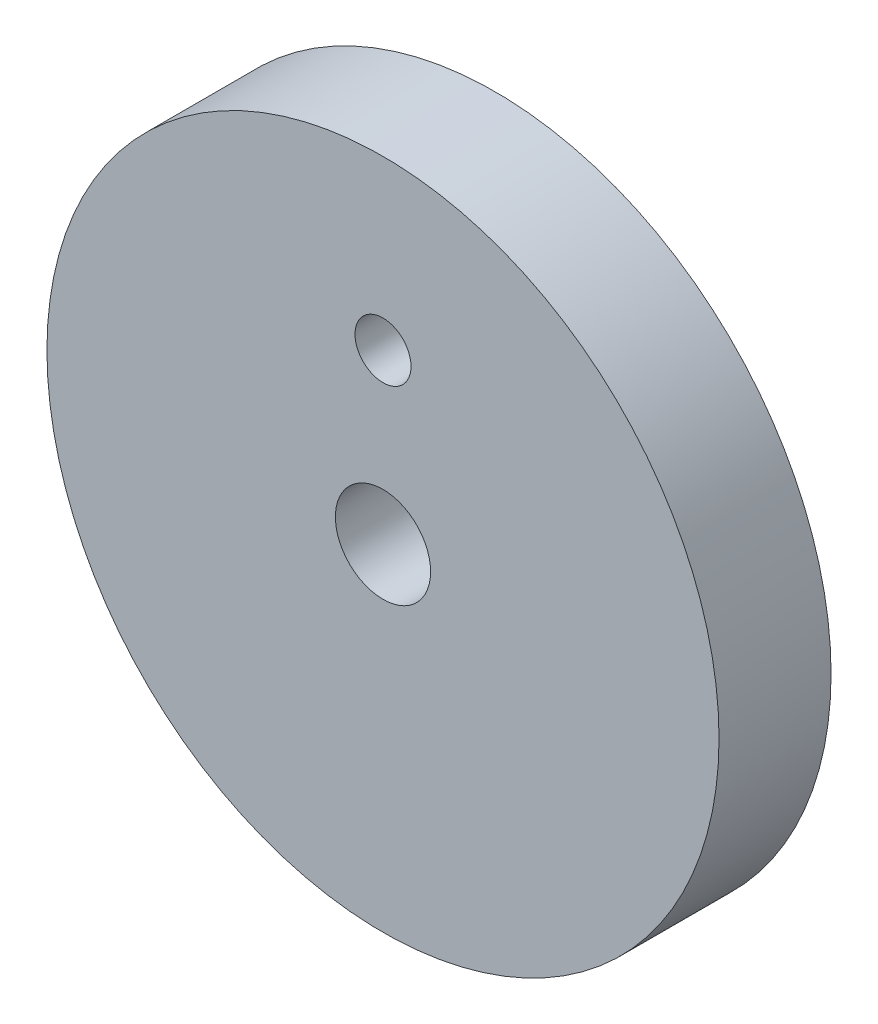
ISO-10303-21;
HEADER;
FILE_DESCRIPTION(('STEP AP214'),'2;1');
FILE_NAME('part.step','',(''),(''),'','','');
FILE_SCHEMA(('AUTOMOTIVE_DESIGN { 1 0 10303 214 1 1 1 1 }'));
ENDSEC;
DATA;
#1=APPLICATION_CONTEXT('core data for automotive mechanical design processes');
#2=APPLICATION_PROTOCOL_DEFINITION('international standard','automotive_design',2000,#1);
#3=PRODUCT_CONTEXT('',#1,'mechanical');
#4=PRODUCT('Part','Part','',(#3));
#5=PRODUCT_RELATED_PRODUCT_CATEGORY('part','',(#4));
#6=PRODUCT_DEFINITION_FORMATION('','',#4);
#7=PRODUCT_DEFINITION_CONTEXT('part definition',#1,'design');
#8=PRODUCT_DEFINITION('design','',#6,#7);
#9=PRODUCT_DEFINITION_SHAPE('','',#8);
#10=(LENGTH_UNIT() NAMED_UNIT(*) SI_UNIT(.MILLI.,.METRE.));
#11=(NAMED_UNIT(*) PLANE_ANGLE_UNIT() SI_UNIT($,.RADIAN.));
#12=(NAMED_UNIT(*) SI_UNIT($,.STERADIAN.) SOLID_ANGLE_UNIT());
#13=UNCERTAINTY_MEASURE_WITH_UNIT(LENGTH_MEASURE(1.E-05),#10,'distance_accuracy_value','');
#14=(GEOMETRIC_REPRESENTATION_CONTEXT(3) GLOBAL_UNCERTAINTY_ASSIGNED_CONTEXT((#13)) GLOBAL_UNIT_ASSIGNED_CONTEXT((#10,
#11,#12)) REPRESENTATION_CONTEXT('',''));
#15=CARTESIAN_POINT('',(0.,0.,0.));
#16=DIRECTION('',(0.,0.,1.));
#17=DIRECTION('',(1.,0.,0.));
#18=AXIS2_PLACEMENT_3D('',#15,#16,#17);
#19=CARTESIAN_POINT('',(0.,0.,10.));
#20=DIRECTION('',(0.,0.,-1.));
#21=DIRECTION('',(-1.,0.,0.));
#22=AXIS2_PLACEMENT_3D('',#19,#20,#21);
#23=CYLINDRICAL_SURFACE('',#22,30.);
#24=CARTESIAN_POINT('',(0.,0.,10.));
#25=DIRECTION('',(0.,0.,1.));
#26=DIRECTION('',(1.,0.,0.));
#27=AXIS2_PLACEMENT_3D('',#24,#25,#26);
#28=CIRCLE('',#27,30.);
#29=CARTESIAN_POINT('',(30.,0.,10.));
#30=VERTEX_POINT('',#29);
#31=EDGE_CURVE('E10',#30,#30,#28,.T.);
#32=ORIENTED_EDGE('',*,*,#31,.F.);
#33=EDGE_LOOP('',(#32));
#34=FACE_BOUND('',#33,.T.);
#35=CARTESIAN_POINT('',(0.,0.,0.));
#36=DIRECTION('',(0.,0.,1.));
#37=DIRECTION('',(1.,0.,0.));
#38=AXIS2_PLACEMENT_3D('',#35,#36,#37);
#39=CIRCLE('',#38,30.);
#40=CARTESIAN_POINT('',(30.,0.,0.));
#41=VERTEX_POINT('',#40);
#42=EDGE_CURVE('E49',#41,#41,#39,.T.);
#43=ORIENTED_EDGE('',*,*,#42,.T.);
#44=EDGE_LOOP('',(#43));
#45=FACE_BOUND('',#44,.T.);
#46=ADVANCED_FACE('F41',(#34,#45),#23,.T.);
#47=CARTESIAN_POINT('',(0.,0.,10.));
#48=DIRECTION('',(0.,0.,1.));
#49=DIRECTION('',(1.,0.,0.));
#50=AXIS2_PLACEMENT_3D('',#47,#48,#49);
#51=PLANE('',#50);
#52=CARTESIAN_POINT('',(0.,0.,10.));
#53=DIRECTION('',(0.,0.,1.));
#54=DIRECTION('',(1.,0.,0.));
#55=AXIS2_PLACEMENT_3D('',#52,#53,#54);
#56=CIRCLE('',#55,4.25);
#57=CARTESIAN_POINT('',(4.25,0.,10.));
#58=VERTEX_POINT('',#57);
#59=EDGE_CURVE('E65',#58,#58,#56,.T.);
#60=ORIENTED_EDGE('',*,*,#59,.F.);
#61=EDGE_LOOP('',(#60));
#62=FACE_BOUND('',#61,.T.);
#63=CARTESIAN_POINT('',(0.,15.,10.));
#64=DIRECTION('',(0.,0.,1.));
#65=DIRECTION('',(1.,0.,0.));
#66=AXIS2_PLACEMENT_3D('',#63,#64,#65);
#67=CIRCLE('',#66,2.5);
#68=CARTESIAN_POINT('',(2.5,15.,10.));
#69=VERTEX_POINT('',#68);
#70=EDGE_CURVE('E56',#69,#69,#67,.T.);
#71=ORIENTED_EDGE('',*,*,#70,.F.);
#72=EDGE_LOOP('',(#71));
#73=FACE_BOUND('',#72,.T.);
#74=ORIENTED_EDGE('',*,*,#31,.T.);
#75=EDGE_LOOP('',(#74));
#76=FACE_BOUND('',#75,.T.);
#77=ADVANCED_FACE('F82',(#62,#73,#76),#51,.T.);
#78=CARTESIAN_POINT('',(0.,0.,0.));
#79=DIRECTION('',(0.,0.,1.));
#80=DIRECTION('',(1.,0.,0.));
#81=AXIS2_PLACEMENT_3D('',#78,#79,#80);
#82=PLANE('',#81);
#83=CARTESIAN_POINT('',(0.,0.,0.));
#84=DIRECTION('',(0.,0.,1.));
#85=DIRECTION('',(1.,0.,0.));
#86=AXIS2_PLACEMENT_3D('',#83,#84,#85);
#87=CIRCLE('',#86,4.25);
#88=CARTESIAN_POINT('',(4.25,0.,0.));
#89=VERTEX_POINT('',#88);
#90=EDGE_CURVE('E44',#89,#89,#87,.F.);
#91=ORIENTED_EDGE('',*,*,#90,.F.);
#92=EDGE_LOOP('',(#91));
#93=FACE_BOUND('',#92,.T.);
#94=CARTESIAN_POINT('',(0.,15.,0.));
#95=DIRECTION('',(0.,0.,1.));
#96=DIRECTION('',(1.,0.,0.));
#97=AXIS2_PLACEMENT_3D('',#94,#95,#96);
#98=CIRCLE('',#97,2.5);
#99=CARTESIAN_POINT('',(2.5,15.,0.));
#100=VERTEX_POINT('',#99);
#101=EDGE_CURVE('E58',#100,#100,#98,.T.);
#102=ORIENTED_EDGE('',*,*,#101,.T.);
#103=EDGE_LOOP('',(#102));
#104=FACE_BOUND('',#103,.T.);
#105=ORIENTED_EDGE('',*,*,#42,.F.);
#106=EDGE_LOOP('',(#105));
#107=FACE_BOUND('',#106,.T.);
#108=ADVANCED_FACE('F78',(#93,#104,#107),#82,.F.);
#109=CARTESIAN_POINT('',(0.,15.,10.));
#110=DIRECTION('',(0.,0.,-1.));
#111=DIRECTION('',(-1.,0.,0.));
#112=AXIS2_PLACEMENT_3D('',#109,#110,#111);
#113=CYLINDRICAL_SURFACE('',#112,2.5);
#114=ORIENTED_EDGE('',*,*,#70,.T.);
#115=EDGE_LOOP('',(#114));
#116=FACE_BOUND('',#115,.T.);
#117=ORIENTED_EDGE('',*,*,#101,.F.);
#118=EDGE_LOOP('',(#117));
#119=FACE_BOUND('',#118,.T.);
#120=ADVANCED_FACE('F81',(#116,#119),#113,.F.);
#121=CARTESIAN_POINT('',(0.,0.,10.));
#122=DIRECTION('',(0.,0.,-1.));
#123=DIRECTION('',(-1.,0.,0.));
#124=AXIS2_PLACEMENT_3D('',#121,#122,#123);
#125=CYLINDRICAL_SURFACE('',#124,4.25);
#126=ORIENTED_EDGE('',*,*,#59,.T.);
#127=EDGE_LOOP('',(#126));
#128=FACE_BOUND('',#127,.T.);
#129=ORIENTED_EDGE('',*,*,#90,.T.);
#130=EDGE_LOOP('',(#129));
#131=FACE_BOUND('',#130,.T.);
#132=ADVANCED_FACE('F76',(#128,#131),#125,.F.);
#133=CLOSED_SHELL('',(#46,#77,#108,#120,#132));
#134=MANIFOLD_SOLID_BREP('B2',#133);
#135=ADVANCED_BREP_SHAPE_REPRESENTATION('',(#18,#134),#14);
#136=SHAPE_DEFINITION_REPRESENTATION(#9,#135);
ENDSEC;
END-ISO-10303-21;
